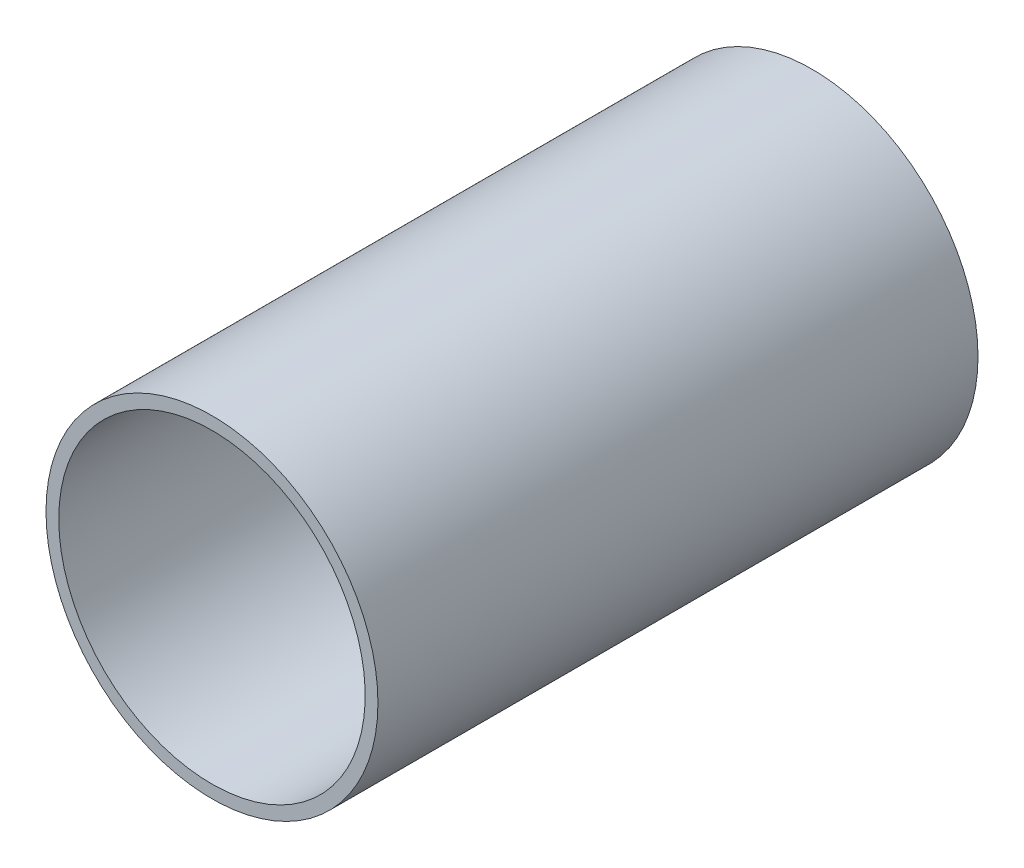
ISO-10303-21;
HEADER;
FILE_DESCRIPTION(('STEP AP214'),'2;1');
FILE_NAME('part.step','',(''),(''),'','','');
FILE_SCHEMA(('AUTOMOTIVE_DESIGN { 1 0 10303 214 1 1 1 1 }'));
ENDSEC;
DATA;
#1=APPLICATION_CONTEXT('core data for automotive mechanical design processes');
#2=APPLICATION_PROTOCOL_DEFINITION('international standard','automotive_design',2000,#1);
#3=PRODUCT_CONTEXT('',#1,'mechanical');
#4=PRODUCT('Part','Part','',(#3));
#5=PRODUCT_RELATED_PRODUCT_CATEGORY('part','',(#4));
#6=PRODUCT_DEFINITION_FORMATION('','',#4);
#7=PRODUCT_DEFINITION_CONTEXT('part definition',#1,'design');
#8=PRODUCT_DEFINITION('design','',#6,#7);
#9=PRODUCT_DEFINITION_SHAPE('','',#8);
#10=(LENGTH_UNIT() NAMED_UNIT(*) SI_UNIT(.MILLI.,.METRE.));
#11=(NAMED_UNIT(*) PLANE_ANGLE_UNIT() SI_UNIT($,.RADIAN.));
#12=(NAMED_UNIT(*) SI_UNIT($,.STERADIAN.) SOLID_ANGLE_UNIT());
#13=UNCERTAINTY_MEASURE_WITH_UNIT(LENGTH_MEASURE(1.E-05),#10,'distance_accuracy_value','');
#14=(GEOMETRIC_REPRESENTATION_CONTEXT(3) GLOBAL_UNCERTAINTY_ASSIGNED_CONTEXT((#13)) GLOBAL_UNIT_ASSIGNED_CONTEXT((#10,
#11,#12)) REPRESENTATION_CONTEXT('',''));
#15=CARTESIAN_POINT('',(0.,0.,0.));
#16=DIRECTION('',(0.,0.,1.));
#17=DIRECTION('',(1.,0.,0.));
#18=AXIS2_PLACEMENT_3D('',#15,#16,#17);
#19=CARTESIAN_POINT('',(76.2,0.,-149.225));
#20=DIRECTION('',(0.,0.,-1.));
#21=DIRECTION('',(-1.,0.,0.));
#22=AXIS2_PLACEMENT_3D('',#19,#20,#21);
#23=PLANE('',#22);
#24=CARTESIAN_POINT('',(0.,0.,-149.225));
#25=DIRECTION('',(0.,0.,-1.));
#26=DIRECTION('',(-1.,0.,0.));
#27=AXIS2_PLACEMENT_3D('',#24,#25,#26);
#28=CIRCLE('',#27,82.55);
#29=CARTESIAN_POINT('',(-82.55,0.,-149.225));
#30=VERTEX_POINT('',#29);
#31=EDGE_CURVE('E10',#30,#30,#28,.T.);
#32=ORIENTED_EDGE('',*,*,#31,.T.);
#33=EDGE_LOOP('',(#32));
#34=FACE_BOUND('',#33,.T.);
#35=CARTESIAN_POINT('',(0.,0.,-149.225));
#36=DIRECTION('',(0.,0.,-1.));
#37=DIRECTION('',(-1.,0.,0.));
#38=AXIS2_PLACEMENT_3D('',#35,#36,#37);
#39=CIRCLE('',#38,76.2);
#40=CARTESIAN_POINT('',(-76.2,0.,-149.225));
#41=VERTEX_POINT('',#40);
#42=EDGE_CURVE('E51',#41,#41,#39,.T.);
#43=ORIENTED_EDGE('',*,*,#42,.F.);
#44=EDGE_LOOP('',(#43));
#45=FACE_BOUND('',#44,.T.);
#46=ADVANCED_FACE('F37',(#34,#45),#23,.T.);
#47=CARTESIAN_POINT('',(0.,0.,149.225));
#48=DIRECTION('',(0.,0.,-1.));
#49=DIRECTION('',(-1.,0.,0.));
#50=AXIS2_PLACEMENT_3D('',#47,#48,#49);
#51=CYLINDRICAL_SURFACE('',#50,82.55);
#52=CARTESIAN_POINT('',(0.,0.,149.225));
#53=DIRECTION('',(0.,0.,-1.));
#54=DIRECTION('',(-1.,0.,0.));
#55=AXIS2_PLACEMENT_3D('',#52,#53,#54);
#56=CIRCLE('',#55,82.55);
#57=CARTESIAN_POINT('',(-82.55,0.,149.225));
#58=VERTEX_POINT('',#57);
#59=EDGE_CURVE('E43',#58,#58,#56,.T.);
#60=ORIENTED_EDGE('',*,*,#59,.T.);
#61=EDGE_LOOP('',(#60));
#62=FACE_BOUND('',#61,.T.);
#63=ORIENTED_EDGE('',*,*,#31,.F.);
#64=EDGE_LOOP('',(#63));
#65=FACE_BOUND('',#64,.T.);
#66=ADVANCED_FACE('F61',(#62,#65),#51,.T.);
#67=CARTESIAN_POINT('',(82.55,0.,149.225));
#68=DIRECTION('',(0.,0.,1.));
#69=DIRECTION('',(1.,0.,0.));
#70=AXIS2_PLACEMENT_3D('',#67,#68,#69);
#71=PLANE('',#70);
#72=CARTESIAN_POINT('',(0.,0.,149.225));
#73=DIRECTION('',(0.,0.,-1.));
#74=DIRECTION('',(-1.,0.,0.));
#75=AXIS2_PLACEMENT_3D('',#72,#73,#74);
#76=CIRCLE('',#75,76.2);
#77=CARTESIAN_POINT('',(-76.2,0.,149.225));
#78=VERTEX_POINT('',#77);
#79=EDGE_CURVE('E47',#78,#78,#76,.T.);
#80=ORIENTED_EDGE('',*,*,#79,.T.);
#81=EDGE_LOOP('',(#80));
#82=FACE_BOUND('',#81,.T.);
#83=ORIENTED_EDGE('',*,*,#59,.F.);
#84=EDGE_LOOP('',(#83));
#85=FACE_BOUND('',#84,.T.);
#86=ADVANCED_FACE('F65',(#82,#85),#71,.T.);
#87=CARTESIAN_POINT('',(0.,0.,149.225));
#88=DIRECTION('',(0.,0.,-1.));
#89=DIRECTION('',(-1.,0.,0.));
#90=AXIS2_PLACEMENT_3D('',#87,#88,#89);
#91=CYLINDRICAL_SURFACE('',#90,76.2);
#92=ORIENTED_EDGE('',*,*,#42,.T.);
#93=EDGE_LOOP('',(#92));
#94=FACE_BOUND('',#93,.T.);
#95=ORIENTED_EDGE('',*,*,#79,.F.);
#96=EDGE_LOOP('',(#95));
#97=FACE_BOUND('',#96,.T.);
#98=ADVANCED_FACE('F57',(#94,#97),#91,.F.);
#99=CLOSED_SHELL('',(#46,#66,#86,#98));
#100=MANIFOLD_SOLID_BREP('B2',#99);
#101=ADVANCED_BREP_SHAPE_REPRESENTATION('',(#18,#100),#14);
#102=SHAPE_DEFINITION_REPRESENTATION(#9,#101);
ENDSEC;
END-ISO-10303-21;
